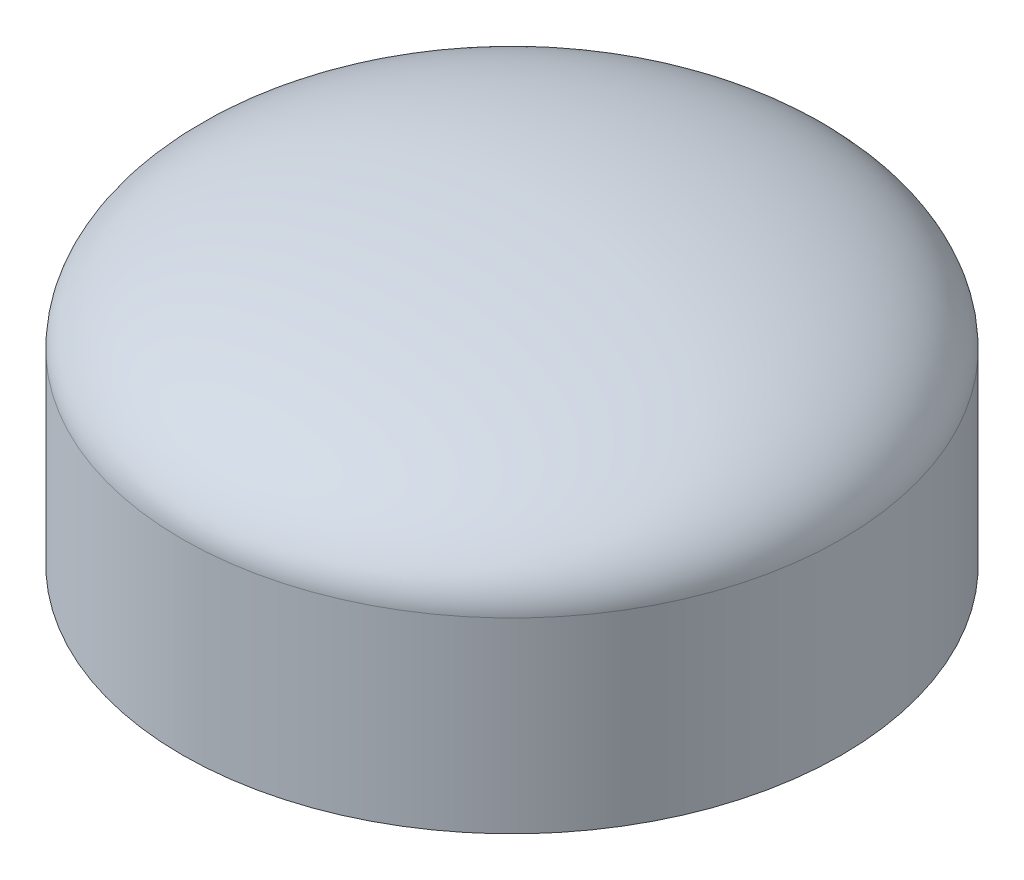
ISO-10303-21;
HEADER;
FILE_DESCRIPTION(('STEP AP214'),'2;1');
FILE_NAME('part.step','',(''),(''),'','','');
FILE_SCHEMA(('AUTOMOTIVE_DESIGN { 1 0 10303 214 1 1 1 1 }'));
ENDSEC;
DATA;
#1=APPLICATION_CONTEXT('core data for automotive mechanical design processes');
#2=APPLICATION_PROTOCOL_DEFINITION('international standard','automotive_design',2000,#1);
#3=PRODUCT_CONTEXT('',#1,'mechanical');
#4=PRODUCT('Part','Part','',(#3));
#5=PRODUCT_RELATED_PRODUCT_CATEGORY('part','',(#4));
#6=PRODUCT_DEFINITION_FORMATION('','',#4);
#7=PRODUCT_DEFINITION_CONTEXT('part definition',#1,'design');
#8=PRODUCT_DEFINITION('design','',#6,#7);
#9=PRODUCT_DEFINITION_SHAPE('','',#8);
#10=(LENGTH_UNIT() NAMED_UNIT(*) SI_UNIT(.MILLI.,.METRE.));
#11=(NAMED_UNIT(*) PLANE_ANGLE_UNIT() SI_UNIT($,.RADIAN.));
#12=(NAMED_UNIT(*) SI_UNIT($,.STERADIAN.) SOLID_ANGLE_UNIT());
#13=UNCERTAINTY_MEASURE_WITH_UNIT(LENGTH_MEASURE(1.E-05),#10,'distance_accuracy_value','');
#14=(GEOMETRIC_REPRESENTATION_CONTEXT(3) GLOBAL_UNCERTAINTY_ASSIGNED_CONTEXT((#13)) GLOBAL_UNIT_ASSIGNED_CONTEXT((#10,
#11,#12)) REPRESENTATION_CONTEXT('',''));
#15=CARTESIAN_POINT('',(0.,0.,0.));
#16=DIRECTION('',(0.,0.,1.));
#17=DIRECTION('',(1.,0.,0.));
#18=AXIS2_PLACEMENT_3D('',#15,#16,#17);
#19=CARTESIAN_POINT('',(41.1,0.,0.));
#20=DIRECTION('',(0.,-1.,0.));
#21=DIRECTION('',(1.,0.,0.));
#22=AXIS2_PLACEMENT_3D('',#19,#20,#21);
#23=PLANE('',#22);
#24=CARTESIAN_POINT('',(0.,0.,0.));
#25=DIRECTION('',(0.,-1.,0.));
#26=DIRECTION('',(1.,0.,0.));
#27=AXIS2_PLACEMENT_3D('',#24,#25,#26);
#28=CIRCLE('',#27,44.1);
#29=CARTESIAN_POINT('',(44.1,0.,0.));
#30=VERTEX_POINT('',#29);
#31=EDGE_CURVE('E57',#30,#30,#28,.T.);
#32=ORIENTED_EDGE('',*,*,#31,.T.);
#33=EDGE_LOOP('',(#32));
#34=FACE_BOUND('',#33,.T.);
#35=CARTESIAN_POINT('',(0.,0.,0.));
#36=DIRECTION('',(0.,-1.,0.));
#37=DIRECTION('',(1.,0.,0.));
#38=AXIS2_PLACEMENT_3D('',#35,#36,#37);
#39=CIRCLE('',#38,41.1);
#40=CARTESIAN_POINT('',(41.1,0.,0.));
#41=VERTEX_POINT('',#40);
#42=EDGE_CURVE('E11',#41,#41,#39,.T.);
#43=ORIENTED_EDGE('',*,*,#42,.F.);
#44=EDGE_LOOP('',(#43));
#45=FACE_BOUND('',#44,.T.);
#46=ADVANCED_FACE('F34',(#34,#45),#23,.T.);
#47=CARTESIAN_POINT('',(0.,38.,0.));
#48=DIRECTION('',(0.,-1.,0.));
#49=DIRECTION('',(1.,0.,0.));
#50=AXIS2_PLACEMENT_3D('',#47,#48,#49);
#51=CYLINDRICAL_SURFACE('',#50,41.1);
#52=ORIENTED_EDGE('',*,*,#42,.T.);
#53=EDGE_LOOP('',(#52));
#54=FACE_BOUND('',#53,.T.);
#55=CARTESIAN_POINT('',(0.,25.,0.));
#56=DIRECTION('',(0.,-1.,0.));
#57=DIRECTION('',(1.,0.,0.));
#58=AXIS2_PLACEMENT_3D('',#55,#56,#57);
#59=CIRCLE('',#58,41.1);
#60=CARTESIAN_POINT('',(41.1,25.,0.));
#61=VERTEX_POINT('',#60);
#62=EDGE_CURVE('E41',#61,#61,#59,.T.);
#63=ORIENTED_EDGE('',*,*,#62,.F.);
#64=EDGE_LOOP('',(#63));
#65=FACE_BOUND('',#64,.T.);
#66=ADVANCED_FACE('F68',(#54,#65),#51,.F.);
#67=CARTESIAN_POINT('',(0.,25.,0.));
#68=DIRECTION('',(0.,0.,-1.));
#69=DIRECTION('',(1.,0.,0.));
#70=AXIS2_PLACEMENT_3D('',#67,#68,#69);
#71=ELLIPSE('',#70,41.1,13.);
#72=TRIMMED_CURVE('',#71,(PARAMETER_VALUE(4.71238898038469)),
(PARAMETER_VALUE(7.85398163397448)),.T.,.PARAMETER.);
#73=CARTESIAN_POINT('',(0.,38.,0.));
#74=DIRECTION('',(0.,-1.,0.));
#75=AXIS1_PLACEMENT('',#73,#74);
#76=SURFACE_OF_REVOLUTION('',#72,#75);
#77=ORIENTED_EDGE('',*,*,#62,.T.);
#78=EDGE_LOOP('',(#77));
#79=FACE_BOUND('',#78,.T.);
#80=CARTESIAN_POINT('',(0.,38.,0.));
#81=VERTEX_POINT('',#80);
#82=VERTEX_LOOP('',#81);
#83=FACE_BOUND('',#82,.T.);
#84=ADVANCED_FACE('F51',(#79,#83),#76,.F.);
#85=CARTESIAN_POINT('',(0.,25.,0.));
#86=DIRECTION('',(0.,0.,1.));
#87=DIRECTION('',(1.,0.,0.));
#88=AXIS2_PLACEMENT_3D('',#85,#86,#87);
#89=ELLIPSE('',#88,44.1,16.);
#90=TRIMMED_CURVE('',#89,(PARAMETER_VALUE(-1.5707963267949)),(PARAMETER_VALUE(1.5707963267949)),
.T.,.PARAMETER.);
#91=CARTESIAN_POINT('',(0.,38.,0.));
#92=DIRECTION('',(0.,-1.,0.));
#93=AXIS1_PLACEMENT('',#91,#92);
#94=SURFACE_OF_REVOLUTION('',#90,#93);
#95=CARTESIAN_POINT('',(0.,41.,0.));
#96=VERTEX_POINT('',#95);
#97=VERTEX_LOOP('',#96);
#98=FACE_BOUND('',#97,.T.);
#99=CARTESIAN_POINT('',(0.,25.,0.));
#100=DIRECTION('',(0.,-1.,0.));
#101=DIRECTION('',(1.,0.,0.));
#102=AXIS2_PLACEMENT_3D('',#99,#100,#101);
#103=CIRCLE('',#102,44.1);
#104=CARTESIAN_POINT('',(44.1,25.,0.));
#105=VERTEX_POINT('',#104);
#106=EDGE_CURVE('E55',#105,#105,#103,.T.);
#107=ORIENTED_EDGE('',*,*,#106,.F.);
#108=EDGE_LOOP('',(#107));
#109=FACE_BOUND('',#108,.T.);
#110=ADVANCED_FACE('F47',(#98,#109),#94,.F.);
#111=CARTESIAN_POINT('',(0.,38.,0.));
#112=DIRECTION('',(0.,-1.,0.));
#113=DIRECTION('',(1.,0.,0.));
#114=AXIS2_PLACEMENT_3D('',#111,#112,#113);
#115=CYLINDRICAL_SURFACE('',#114,44.1);
#116=ORIENTED_EDGE('',*,*,#106,.T.);
#117=EDGE_LOOP('',(#116));
#118=FACE_BOUND('',#117,.T.);
#119=ORIENTED_EDGE('',*,*,#31,.F.);
#120=EDGE_LOOP('',(#119));
#121=FACE_BOUND('',#120,.T.);
#122=ADVANCED_FACE('F50',(#118,#121),#115,.T.);
#123=CLOSED_SHELL('',(#46,#66,#84,#110,#122));
#124=MANIFOLD_SOLID_BREP('B2',#123);
#125=ADVANCED_BREP_SHAPE_REPRESENTATION('',(#18,#124),#14);
#126=SHAPE_DEFINITION_REPRESENTATION(#9,#125);
ENDSEC;
END-ISO-10303-21;
